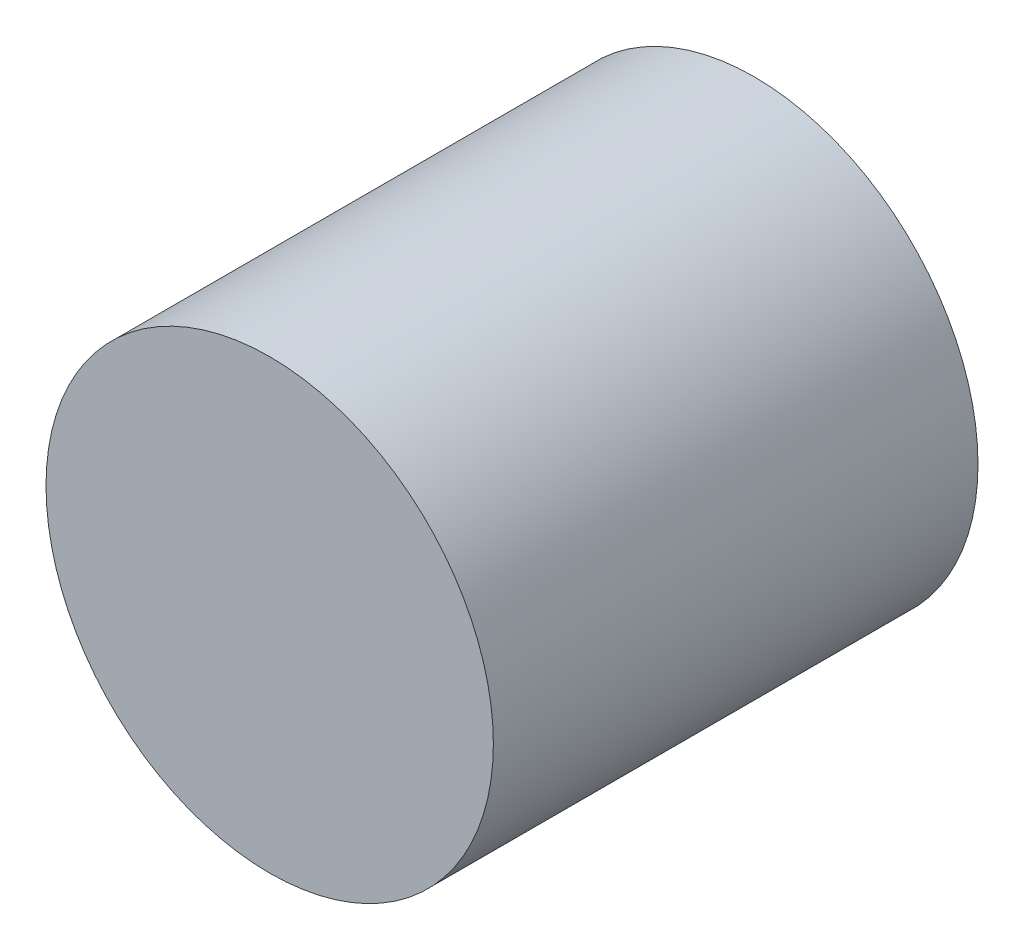
ISO-10303-21;
HEADER;
FILE_DESCRIPTION(('STEP AP214'),'2;1');
FILE_NAME('part.step','',(''),(''),'','','');
FILE_SCHEMA(('AUTOMOTIVE_DESIGN { 1 0 10303 214 1 1 1 1 }'));
ENDSEC;
DATA;
#1=APPLICATION_CONTEXT('core data for automotive mechanical design processes');
#2=APPLICATION_PROTOCOL_DEFINITION('international standard','automotive_design',2000,#1);
#3=PRODUCT_CONTEXT('',#1,'mechanical');
#4=PRODUCT('Part','Part','',(#3));
#5=PRODUCT_RELATED_PRODUCT_CATEGORY('part','',(#4));
#6=PRODUCT_DEFINITION_FORMATION('','',#4);
#7=PRODUCT_DEFINITION_CONTEXT('part definition',#1,'design');
#8=PRODUCT_DEFINITION('design','',#6,#7);
#9=PRODUCT_DEFINITION_SHAPE('','',#8);
#10=(LENGTH_UNIT() NAMED_UNIT(*) SI_UNIT(.MILLI.,.METRE.));
#11=(NAMED_UNIT(*) PLANE_ANGLE_UNIT() SI_UNIT($,.RADIAN.));
#12=(NAMED_UNIT(*) SI_UNIT($,.STERADIAN.) SOLID_ANGLE_UNIT());
#13=UNCERTAINTY_MEASURE_WITH_UNIT(LENGTH_MEASURE(1.E-05),#10,'distance_accuracy_value','');
#14=(GEOMETRIC_REPRESENTATION_CONTEXT(3) GLOBAL_UNCERTAINTY_ASSIGNED_CONTEXT((#13)) GLOBAL_UNIT_ASSIGNED_CONTEXT((#10,
#11,#12)) REPRESENTATION_CONTEXT('',''));
#15=CARTESIAN_POINT('',(0.,0.,0.));
#16=DIRECTION('',(0.,0.,1.));
#17=DIRECTION('',(1.,0.,0.));
#18=AXIS2_PLACEMENT_3D('',#15,#16,#17);
#19=CARTESIAN_POINT('',(6.,6.,13.));
#20=DIRECTION('',(0.,0.,-1.));
#21=DIRECTION('',(-1.,0.,0.));
#22=AXIS2_PLACEMENT_3D('',#19,#20,#21);
#23=CYLINDRICAL_SURFACE('',#22,6.);
#24=CARTESIAN_POINT('',(6.,6.,13.));
#25=DIRECTION('',(0.,0.,1.));
#26=DIRECTION('',(1.,0.,0.));
#27=AXIS2_PLACEMENT_3D('',#24,#25,#26);
#28=CIRCLE('',#27,6.);
#29=CARTESIAN_POINT('',(0.,6.,13.));
#30=VERTEX_POINT('',#29);
#31=EDGE_CURVE('E10',#30,#30,#28,.T.);
#32=CARTESIAN_POINT('',(6.,6.,0.));
#33=DIRECTION('',(0.,0.,1.));
#34=DIRECTION('',(1.,0.,0.));
#35=AXIS2_PLACEMENT_3D('',#32,#33,#34);
#36=CIRCLE('',#35,6.);
#37=CARTESIAN_POINT('',(0.,6.,0.));
#38=VERTEX_POINT('',#37);
#39=EDGE_CURVE('E42',#38,#38,#36,.T.);
#40=CARTESIAN_POINT('',(0.,6.,13.));
#41=CARTESIAN_POINT('',(0.,6.,12.8645833333333));
#42=CARTESIAN_POINT('',(0.,6.,12.7291666666667));
#43=CARTESIAN_POINT('',(0.,6.,12.4583333333333));
#44=CARTESIAN_POINT('',(0.,6.,12.3229166666667));
#45=CARTESIAN_POINT('',(0.,6.,12.0520833333333));
#46=CARTESIAN_POINT('',(0.,6.,11.9166666666667));
#47=CARTESIAN_POINT('',(0.,6.,11.6458333333333));
#48=CARTESIAN_POINT('',(0.,6.,11.5104166666667));
#49=CARTESIAN_POINT('',(0.,6.,11.2395833333333));
#50=CARTESIAN_POINT('',(0.,6.,11.1041666666667));
#51=CARTESIAN_POINT('',(0.,6.,10.8333333333333));
#52=CARTESIAN_POINT('',(0.,6.,10.6979166666667));
#53=CARTESIAN_POINT('',(0.,6.,10.4270833333333));
#54=CARTESIAN_POINT('',(0.,6.,10.2916666666667));
#55=CARTESIAN_POINT('',(0.,6.,10.0208333333333));
#56=CARTESIAN_POINT('',(0.,6.,9.88541666666667));
#57=CARTESIAN_POINT('',(0.,6.,9.61458333333333));
#58=CARTESIAN_POINT('',(0.,6.,9.47916666666667));
#59=CARTESIAN_POINT('',(0.,6.,9.20833333333333));
#60=CARTESIAN_POINT('',(0.,6.,9.07291666666666));
#61=CARTESIAN_POINT('',(0.,6.,8.80208333333333));
#62=CARTESIAN_POINT('',(0.,6.,8.66666666666667));
#63=CARTESIAN_POINT('',(0.,6.,8.39583333333333));
#64=CARTESIAN_POINT('',(0.,6.,8.26041666666667));
#65=CARTESIAN_POINT('',(0.,6.,7.98958333333333));
#66=CARTESIAN_POINT('',(0.,6.,7.85416666666667));
#67=CARTESIAN_POINT('',(0.,6.,7.58333333333333));
#68=CARTESIAN_POINT('',(0.,6.,7.44791666666667));
#69=CARTESIAN_POINT('',(0.,6.,7.17708333333333));
#70=CARTESIAN_POINT('',(0.,6.,7.04166666666667));
#71=CARTESIAN_POINT('',(0.,6.,6.77083333333333));
#72=CARTESIAN_POINT('',(0.,6.,6.63541666666667));
#73=CARTESIAN_POINT('',(0.,6.,6.36458333333333));
#74=CARTESIAN_POINT('',(0.,6.,6.22916666666667));
#75=CARTESIAN_POINT('',(0.,6.,5.95833333333333));
#76=CARTESIAN_POINT('',(0.,6.,5.82291666666667));
#77=CARTESIAN_POINT('',(0.,6.,5.55208333333333));
#78=CARTESIAN_POINT('',(0.,6.,5.41666666666667));
#79=CARTESIAN_POINT('',(0.,6.,5.14583333333333));
#80=CARTESIAN_POINT('',(0.,6.,5.01041666666667));
#81=CARTESIAN_POINT('',(0.,6.,4.73958333333333));
#82=CARTESIAN_POINT('',(0.,6.,4.60416666666667));
#83=CARTESIAN_POINT('',(0.,6.,4.33333333333333));
#84=CARTESIAN_POINT('',(0.,6.,4.19791666666667));
#85=CARTESIAN_POINT('',(0.,6.,3.92708333333333));
#86=CARTESIAN_POINT('',(0.,6.,3.79166666666667));
#87=CARTESIAN_POINT('',(0.,6.,3.52083333333333));
#88=CARTESIAN_POINT('',(0.,6.,3.38541666666667));
#89=CARTESIAN_POINT('',(0.,6.,3.11458333333333));
#90=CARTESIAN_POINT('',(0.,6.,2.97916666666667));
#91=CARTESIAN_POINT('',(0.,6.,2.70833333333333));
#92=CARTESIAN_POINT('',(0.,6.,2.57291666666667));
#93=CARTESIAN_POINT('',(0.,6.,2.30208333333333));
#94=CARTESIAN_POINT('',(0.,6.,2.16666666666667));
#95=CARTESIAN_POINT('',(0.,6.,1.89583333333333));
#96=CARTESIAN_POINT('',(0.,6.,1.76041666666667));
#97=CARTESIAN_POINT('',(0.,6.,1.48958333333333));
#98=CARTESIAN_POINT('',(0.,6.,1.35416666666667));
#99=CARTESIAN_POINT('',(0.,6.,1.08333333333333));
#100=CARTESIAN_POINT('',(0.,6.,0.947916666666667));
#101=CARTESIAN_POINT('',(0.,6.,0.677083333333334));
#102=CARTESIAN_POINT('',(0.,6.,0.541666666666667));
#103=CARTESIAN_POINT('',(0.,6.,0.270833333333334));
#104=CARTESIAN_POINT('',(0.,6.,0.135416666666667));
#105=CARTESIAN_POINT('',(0.,6.,0.));
#106=B_SPLINE_CURVE_WITH_KNOTS('',3,(#40,#41,#42,#43,#44,#45,#46,#47,#48,#49,#50,#51,#52,#53,
#54,#55,#56,#57,#58,#59,#60,#61,#62,#63,#64,#65,#66,#67,#68,#69,#70,#71,#72,#73,#74,#75,#76,#77,
#78,#79,#80,#81,#82,#83,#84,#85,#86,#87,#88,#89,#90,#91,#92,#93,#94,#95,#96,#97,#98,#99,#100,
#101,#102,#103,#104,#105),.UNSPECIFIED.,.F.,.F.,(4,2,2,2,2,2,2,2,2,2,2,2,2,2,2,2,2,2,2,2,2,2,2,
2,2,2,2,2,2,2,2,2,4),(0.,0.40625,0.812500000000001,1.21875,1.625,2.03125,2.4375,2.84375,3.25,
3.65625,4.0625,4.46875,4.875,5.28125,5.6875,6.09375,6.5,6.90625,7.3125,7.71875,8.125,8.53125,
8.9375,9.34375,9.75,10.15625,10.5625,10.96875,11.375,11.78125,12.1875,12.59375,13.),.UNSPECIFIED.);
#107=EDGE_CURVE('BSEAM41',#30,#38,#106,.T.);
#108=ORIENTED_EDGE('',*,*,#31,.F.);
#109=ORIENTED_EDGE('',*,*,#39,.T.);
#110=ORIENTED_EDGE('',*,*,#107,.T.);
#111=ORIENTED_EDGE('',*,*,#107,.F.);
#112=EDGE_LOOP('',(#108,#110,#109,#111));
#113=FACE_BOUND('',#112,.T.);
#114=ADVANCED_FACE('F41',(#113),#23,.T.);
#115=CARTESIAN_POINT('',(6.,6.,13.));
#116=DIRECTION('',(0.,0.,1.));
#117=DIRECTION('',(1.,0.,0.));
#118=AXIS2_PLACEMENT_3D('',#115,#116,#117);
#119=PLANE('',#118);
#120=ORIENTED_EDGE('',*,*,#31,.T.);
#121=EDGE_LOOP('',(#120));
#122=FACE_BOUND('',#121,.T.);
#123=ADVANCED_FACE('F57',(#122),#119,.T.);
#124=CARTESIAN_POINT('',(6.,6.,0.));
#125=DIRECTION('',(0.,0.,1.));
#126=DIRECTION('',(1.,0.,0.));
#127=AXIS2_PLACEMENT_3D('',#124,#125,#126);
#128=PLANE('',#127);
#129=ORIENTED_EDGE('',*,*,#39,.F.);
#130=EDGE_LOOP('',(#129));
#131=FACE_BOUND('',#130,.T.);
#132=ADVANCED_FACE('F53',(#131),#128,.F.);
#133=CLOSED_SHELL('',(#114,#123,#132));
#134=MANIFOLD_SOLID_BREP('B2',#133);
#135=ADVANCED_BREP_SHAPE_REPRESENTATION('',(#18,#134),#14);
#136=SHAPE_DEFINITION_REPRESENTATION(#9,#135);
ENDSEC;
END-ISO-10303-21;
